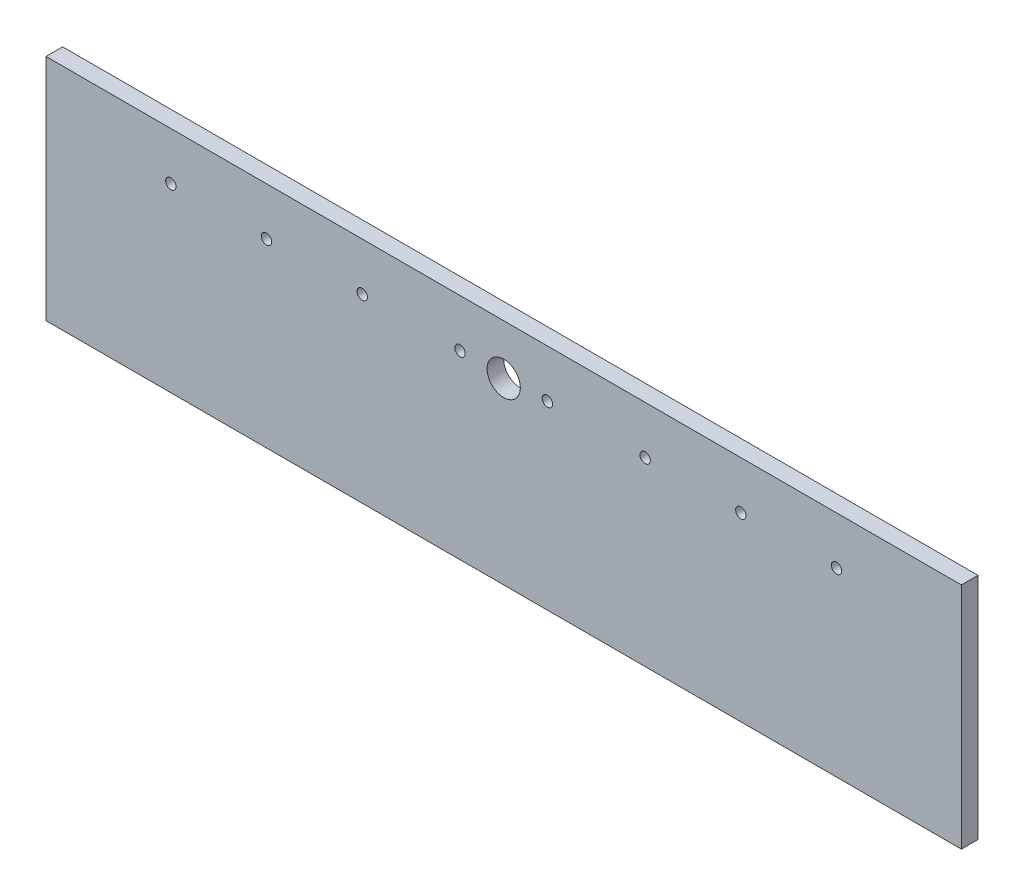
ISO-10303-21;
HEADER;
FILE_DESCRIPTION(('STEP AP214'),'2;1');
FILE_NAME('part.step','',(''),(''),'','','');
FILE_SCHEMA(('AUTOMOTIVE_DESIGN { 1 0 10303 214 1 1 1 1 }'));
ENDSEC;
DATA;
#1=APPLICATION_CONTEXT('core data for automotive mechanical design processes');
#2=APPLICATION_PROTOCOL_DEFINITION('international standard','automotive_design',2000,#1);
#3=PRODUCT_CONTEXT('',#1,'mechanical');
#4=PRODUCT('Part','Part','',(#3));
#5=PRODUCT_RELATED_PRODUCT_CATEGORY('part','',(#4));
#6=PRODUCT_DEFINITION_FORMATION('','',#4);
#7=PRODUCT_DEFINITION_CONTEXT('part definition',#1,'design');
#8=PRODUCT_DEFINITION('design','',#6,#7);
#9=PRODUCT_DEFINITION_SHAPE('','',#8);
#10=(LENGTH_UNIT() NAMED_UNIT(*) SI_UNIT(.MILLI.,.METRE.));
#11=(NAMED_UNIT(*) PLANE_ANGLE_UNIT() SI_UNIT($,.RADIAN.));
#12=(NAMED_UNIT(*) SI_UNIT($,.STERADIAN.) SOLID_ANGLE_UNIT());
#13=UNCERTAINTY_MEASURE_WITH_UNIT(LENGTH_MEASURE(1.E-05),#10,'distance_accuracy_value','');
#14=(GEOMETRIC_REPRESENTATION_CONTEXT(3) GLOBAL_UNCERTAINTY_ASSIGNED_CONTEXT((#13)) GLOBAL_UNIT_ASSIGNED_CONTEXT((#10,
#11,#12)) REPRESENTATION_CONTEXT('',''));
#15=CARTESIAN_POINT('',(0.,0.,0.));
#16=DIRECTION('',(0.,0.,1.));
#17=DIRECTION('',(1.,0.,0.));
#18=AXIS2_PLACEMENT_3D('',#15,#16,#17);
#19=CARTESIAN_POINT('',(0.,0.,25.4));
#20=DIRECTION('',(0.,0.,-1.));
#21=DIRECTION('',(-1.,0.,0.));
#22=AXIS2_PLACEMENT_3D('',#19,#20,#21);
#23=PLANE('',#22);
#24=DIRECTION('',(0.,-1.,0.));
#25=VECTOR('',#24,1.);
#26=CARTESIAN_POINT('',(0.,0.,25.4));
#27=LINE('',#26,#25);
#28=CARTESIAN_POINT('',(0.,349.25,25.4));
#29=VERTEX_POINT('',#28);
#30=CARTESIAN_POINT('',(0.,0.,25.4));
#31=VERTEX_POINT('',#30);
#32=EDGE_CURVE('E92',#29,#31,#27,.T.);
#33=ORIENTED_EDGE('',*,*,#32,.T.);
#34=DIRECTION('',(1.,0.,0.));
#35=VECTOR('',#34,1.);
#36=CARTESIAN_POINT('',(0.,0.,25.4));
#37=LINE('',#36,#35);
#38=CARTESIAN_POINT('',(1397.,0.,25.4));
#39=VERTEX_POINT('',#38);
#40=EDGE_CURVE('E87',#31,#39,#37,.T.);
#41=ORIENTED_EDGE('',*,*,#40,.T.);
#42=DIRECTION('',(0.,1.,0.));
#43=VECTOR('',#42,1.);
#44=CARTESIAN_POINT('',(1397.,0.,25.4));
#45=LINE('',#44,#43);
#46=CARTESIAN_POINT('',(1397.,349.25,25.4));
#47=VERTEX_POINT('',#46);
#48=EDGE_CURVE('E90',#39,#47,#45,.T.);
#49=ORIENTED_EDGE('',*,*,#48,.T.);
#50=DIRECTION('',(-1.,0.,0.));
#51=VECTOR('',#50,1.);
#52=CARTESIAN_POINT('',(0.,349.25,25.4));
#53=LINE('',#52,#51);
#54=EDGE_CURVE('E57',#47,#29,#53,.T.);
#55=ORIENTED_EDGE('',*,*,#54,.T.);
#56=EDGE_LOOP('',(#33,#41,#49,#55));
#57=FACE_BOUND('',#56,.T.);
#58=CARTESIAN_POINT('',(698.5,273.05,25.4));
#59=DIRECTION('',(0.,0.,1.));
#60=DIRECTION('',(1.,0.,0.));
#61=AXIS2_PLACEMENT_3D('',#58,#59,#60);
#62=CIRCLE('',#61,25.4);
#63=CARTESIAN_POINT('',(723.9,273.05,25.4));
#64=VERTEX_POINT('',#63);
#65=EDGE_CURVE('E112',#64,#64,#62,.T.);
#66=ORIENTED_EDGE('',*,*,#65,.F.);
#67=EDGE_LOOP('',(#66));
#68=FACE_BOUND('',#67,.T.);
#69=CARTESIAN_POINT('',(190.5,276.225,25.4));
#70=DIRECTION('',(0.,0.,1.));
#71=DIRECTION('',(1.,0.,0.));
#72=AXIS2_PLACEMENT_3D('',#69,#70,#71);
#73=CIRCLE('',#72,7.93749999999998);
#74=CARTESIAN_POINT('',(198.4375,276.225,25.4));
#75=VERTEX_POINT('',#74);
#76=EDGE_CURVE('E134',#75,#75,#73,.T.);
#77=ORIENTED_EDGE('',*,*,#76,.F.);
#78=EDGE_LOOP('',(#77));
#79=FACE_BOUND('',#78,.T.);
#80=CARTESIAN_POINT('',(336.55,276.225,25.4));
#81=DIRECTION('',(0.,0.,1.));
#82=DIRECTION('',(1.,0.,0.));
#83=AXIS2_PLACEMENT_3D('',#80,#81,#82);
#84=CIRCLE('',#83,7.93749999999998);
#85=CARTESIAN_POINT('',(344.4875,276.225,25.4));
#86=VERTEX_POINT('',#85);
#87=EDGE_CURVE('E142',#86,#86,#84,.T.);
#88=ORIENTED_EDGE('',*,*,#87,.F.);
#89=EDGE_LOOP('',(#88));
#90=FACE_BOUND('',#89,.T.);
#91=CARTESIAN_POINT('',(482.6,276.225,25.4));
#92=DIRECTION('',(0.,0.,1.));
#93=DIRECTION('',(1.,0.,0.));
#94=AXIS2_PLACEMENT_3D('',#91,#92,#93);
#95=CIRCLE('',#94,7.93749999999998);
#96=CARTESIAN_POINT('',(490.5375,276.225,25.4));
#97=VERTEX_POINT('',#96);
#98=EDGE_CURVE('E150',#97,#97,#95,.T.);
#99=ORIENTED_EDGE('',*,*,#98,.F.);
#100=EDGE_LOOP('',(#99));
#101=FACE_BOUND('',#100,.T.);
#102=CARTESIAN_POINT('',(631.825,276.225,25.4));
#103=DIRECTION('',(0.,0.,1.));
#104=DIRECTION('',(1.,0.,0.));
#105=AXIS2_PLACEMENT_3D('',#102,#103,#104);
#106=CIRCLE('',#105,7.93750000000009);
#107=CARTESIAN_POINT('',(639.7625,276.225,25.4));
#108=VERTEX_POINT('',#107);
#109=EDGE_CURVE('E158',#108,#108,#106,.T.);
#110=ORIENTED_EDGE('',*,*,#109,.F.);
#111=EDGE_LOOP('',(#110));
#112=FACE_BOUND('',#111,.T.);
#113=CARTESIAN_POINT('',(1206.5,276.225000000001,25.4));
#114=DIRECTION('',(0.,0.,1.));
#115=DIRECTION('',(-1.,0.,0.));
#116=AXIS2_PLACEMENT_3D('',#113,#114,#115);
#117=CIRCLE('',#116,7.93749999999978);
#118=CARTESIAN_POINT('',(1198.5625,276.225000000001,25.4));
#119=VERTEX_POINT('',#118);
#120=EDGE_CURVE('E166',#119,#119,#117,.T.);
#121=ORIENTED_EDGE('',*,*,#120,.F.);
#122=EDGE_LOOP('',(#121));
#123=FACE_BOUND('',#122,.T.);
#124=CARTESIAN_POINT('',(1060.45,276.225,25.4));
#125=DIRECTION('',(0.,0.,1.));
#126=DIRECTION('',(-1.,0.,0.));
#127=AXIS2_PLACEMENT_3D('',#124,#125,#126);
#128=CIRCLE('',#127,7.93749999999996);
#129=CARTESIAN_POINT('',(1052.5125,276.225,25.4));
#130=VERTEX_POINT('',#129);
#131=EDGE_CURVE('E174',#130,#130,#128,.T.);
#132=ORIENTED_EDGE('',*,*,#131,.F.);
#133=EDGE_LOOP('',(#132));
#134=FACE_BOUND('',#133,.T.);
#135=CARTESIAN_POINT('',(914.4,276.225,25.4));
#136=DIRECTION('',(0.,0.,1.));
#137=DIRECTION('',(-1.,0.,0.));
#138=AXIS2_PLACEMENT_3D('',#135,#136,#137);
#139=CIRCLE('',#138,7.93749999999998);
#140=CARTESIAN_POINT('',(906.4625,276.225,25.4));
#141=VERTEX_POINT('',#140);
#142=EDGE_CURVE('E182',#141,#141,#139,.T.);
#143=ORIENTED_EDGE('',*,*,#142,.F.);
#144=EDGE_LOOP('',(#143));
#145=FACE_BOUND('',#144,.T.);
#146=CARTESIAN_POINT('',(765.175,276.225,25.4));
#147=DIRECTION('',(0.,0.,1.));
#148=DIRECTION('',(-1.,0.,0.));
#149=AXIS2_PLACEMENT_3D('',#146,#147,#148);
#150=CIRCLE('',#149,7.9375000000001);
#151=CARTESIAN_POINT('',(757.2375,276.225,25.4));
#152=VERTEX_POINT('',#151);
#153=EDGE_CURVE('E190',#152,#152,#150,.T.);
#154=ORIENTED_EDGE('',*,*,#153,.F.);
#155=EDGE_LOOP('',(#154));
#156=FACE_BOUND('',#155,.T.);
#157=ADVANCED_FACE('F39',(#57,#68,#79,#90,#101,#112,#123,#134,#145,#156),#23,.F.);
#158=CARTESIAN_POINT('',(0.,0.,0.));
#159=DIRECTION('',(0.,0.,-1.));
#160=DIRECTION('',(-1.,0.,0.));
#161=AXIS2_PLACEMENT_3D('',#158,#159,#160);
#162=PLANE('',#161);
#163=CARTESIAN_POINT('',(914.4,276.225,0.));
#164=DIRECTION('',(0.,0.,1.));
#165=DIRECTION('',(-1.,0.,0.));
#166=AXIS2_PLACEMENT_3D('',#163,#164,#165);
#167=CIRCLE('',#166,7.93749999999998);
#168=CARTESIAN_POINT('',(906.4625,276.225,0.));
#169=VERTEX_POINT('',#168);
#170=EDGE_CURVE('E186',#169,#169,#167,.T.);
#171=ORIENTED_EDGE('',*,*,#170,.T.);
#172=EDGE_LOOP('',(#171));
#173=FACE_BOUND('',#172,.T.);
#174=CARTESIAN_POINT('',(1206.5,276.225000000001,0.));
#175=DIRECTION('',(0.,0.,1.));
#176=DIRECTION('',(-1.,0.,0.));
#177=AXIS2_PLACEMENT_3D('',#174,#175,#176);
#178=CIRCLE('',#177,7.93749999999978);
#179=CARTESIAN_POINT('',(1198.5625,276.225000000001,0.));
#180=VERTEX_POINT('',#179);
#181=EDGE_CURVE('E170',#180,#180,#178,.T.);
#182=ORIENTED_EDGE('',*,*,#181,.T.);
#183=EDGE_LOOP('',(#182));
#184=FACE_BOUND('',#183,.T.);
#185=CARTESIAN_POINT('',(482.6,276.225,0.));
#186=DIRECTION('',(0.,0.,1.));
#187=DIRECTION('',(1.,0.,0.));
#188=AXIS2_PLACEMENT_3D('',#185,#186,#187);
#189=CIRCLE('',#188,7.93749999999998);
#190=CARTESIAN_POINT('',(490.5375,276.225,0.));
#191=VERTEX_POINT('',#190);
#192=EDGE_CURVE('E154',#191,#191,#189,.T.);
#193=ORIENTED_EDGE('',*,*,#192,.T.);
#194=EDGE_LOOP('',(#193));
#195=FACE_BOUND('',#194,.T.);
#196=CARTESIAN_POINT('',(190.5,276.225,0.));
#197=DIRECTION('',(0.,0.,1.));
#198=DIRECTION('',(1.,0.,0.));
#199=AXIS2_PLACEMENT_3D('',#196,#197,#198);
#200=CIRCLE('',#199,7.93749999999998);
#201=CARTESIAN_POINT('',(198.4375,276.225,0.));
#202=VERTEX_POINT('',#201);
#203=EDGE_CURVE('E138',#202,#202,#200,.T.);
#204=ORIENTED_EDGE('',*,*,#203,.T.);
#205=EDGE_LOOP('',(#204));
#206=FACE_BOUND('',#205,.T.);
#207=DIRECTION('',(0.,-1.,0.));
#208=VECTOR('',#207,1.);
#209=CARTESIAN_POINT('',(0.,0.,0.));
#210=LINE('',#209,#208);
#211=CARTESIAN_POINT('',(0.,349.25,0.));
#212=VERTEX_POINT('',#211);
#213=CARTESIAN_POINT('',(0.,0.,0.));
#214=VERTEX_POINT('',#213);
#215=EDGE_CURVE('E108',#212,#214,#210,.T.);
#216=ORIENTED_EDGE('',*,*,#215,.F.);
#217=DIRECTION('',(-1.,0.,0.));
#218=VECTOR('',#217,1.);
#219=CARTESIAN_POINT('',(0.,349.25,0.));
#220=LINE('',#219,#218);
#221=CARTESIAN_POINT('',(1397.,349.25,0.));
#222=VERTEX_POINT('',#221);
#223=EDGE_CURVE('E80',#222,#212,#220,.T.);
#224=ORIENTED_EDGE('',*,*,#223,.F.);
#225=DIRECTION('',(0.,1.,0.));
#226=VECTOR('',#225,1.);
#227=CARTESIAN_POINT('',(1397.,0.,0.));
#228=LINE('',#227,#226);
#229=CARTESIAN_POINT('',(1397.,0.,0.));
#230=VERTEX_POINT('',#229);
#231=EDGE_CURVE('E74',#230,#222,#228,.T.);
#232=ORIENTED_EDGE('',*,*,#231,.F.);
#233=DIRECTION('',(1.,0.,0.));
#234=VECTOR('',#233,1.);
#235=CARTESIAN_POINT('',(0.,0.,0.));
#236=LINE('',#235,#234);
#237=EDGE_CURVE('E97',#214,#230,#236,.T.);
#238=ORIENTED_EDGE('',*,*,#237,.F.);
#239=EDGE_LOOP('',(#216,#224,#232,#238));
#240=FACE_BOUND('',#239,.T.);
#241=CARTESIAN_POINT('',(698.5,273.05,0.));
#242=DIRECTION('',(0.,0.,1.));
#243=DIRECTION('',(1.,0.,0.));
#244=AXIS2_PLACEMENT_3D('',#241,#242,#243);
#245=CIRCLE('',#244,25.4);
#246=CARTESIAN_POINT('',(723.9,273.05,0.));
#247=VERTEX_POINT('',#246);
#248=EDGE_CURVE('E130',#247,#247,#245,.T.);
#249=ORIENTED_EDGE('',*,*,#248,.T.);
#250=EDGE_LOOP('',(#249));
#251=FACE_BOUND('',#250,.T.);
#252=CARTESIAN_POINT('',(336.55,276.225,0.));
#253=DIRECTION('',(0.,0.,1.));
#254=DIRECTION('',(1.,0.,0.));
#255=AXIS2_PLACEMENT_3D('',#252,#253,#254);
#256=CIRCLE('',#255,7.93749999999998);
#257=CARTESIAN_POINT('',(344.4875,276.225,0.));
#258=VERTEX_POINT('',#257);
#259=EDGE_CURVE('E146',#258,#258,#256,.T.);
#260=ORIENTED_EDGE('',*,*,#259,.T.);
#261=EDGE_LOOP('',(#260));
#262=FACE_BOUND('',#261,.T.);
#263=CARTESIAN_POINT('',(631.825,276.225,0.));
#264=DIRECTION('',(0.,0.,1.));
#265=DIRECTION('',(1.,0.,0.));
#266=AXIS2_PLACEMENT_3D('',#263,#264,#265);
#267=CIRCLE('',#266,7.93750000000009);
#268=CARTESIAN_POINT('',(639.7625,276.225,0.));
#269=VERTEX_POINT('',#268);
#270=EDGE_CURVE('E162',#269,#269,#267,.T.);
#271=ORIENTED_EDGE('',*,*,#270,.T.);
#272=EDGE_LOOP('',(#271));
#273=FACE_BOUND('',#272,.T.);
#274=CARTESIAN_POINT('',(1060.45,276.225,0.));
#275=DIRECTION('',(0.,0.,1.));
#276=DIRECTION('',(-1.,0.,0.));
#277=AXIS2_PLACEMENT_3D('',#274,#275,#276);
#278=CIRCLE('',#277,7.93749999999996);
#279=CARTESIAN_POINT('',(1052.5125,276.225,0.));
#280=VERTEX_POINT('',#279);
#281=EDGE_CURVE('E178',#280,#280,#278,.T.);
#282=ORIENTED_EDGE('',*,*,#281,.T.);
#283=EDGE_LOOP('',(#282));
#284=FACE_BOUND('',#283,.T.);
#285=CARTESIAN_POINT('',(765.175,276.225,0.));
#286=DIRECTION('',(0.,0.,1.));
#287=DIRECTION('',(-1.,0.,0.));
#288=AXIS2_PLACEMENT_3D('',#285,#286,#287);
#289=CIRCLE('',#288,7.9375000000001);
#290=CARTESIAN_POINT('',(757.2375,276.225,0.));
#291=VERTEX_POINT('',#290);
#292=EDGE_CURVE('E194',#291,#291,#289,.T.);
#293=ORIENTED_EDGE('',*,*,#292,.T.);
#294=EDGE_LOOP('',(#293));
#295=FACE_BOUND('',#294,.T.);
#296=ADVANCED_FACE('F125',(#173,#184,#195,#206,#240,#251,#262,#273,#284,#295),#162,.T.);
#297=CARTESIAN_POINT('',(0.,0.,25.4));
#298=DIRECTION('',(1.,0.,0.));
#299=DIRECTION('',(0.,0.,-1.));
#300=AXIS2_PLACEMENT_3D('',#297,#298,#299);
#301=PLANE('',#300);
#302=ORIENTED_EDGE('',*,*,#215,.T.);
#303=DIRECTION('',(0.,0.,-1.));
#304=VECTOR('',#303,1.);
#305=CARTESIAN_POINT('',(0.,0.,25.4));
#306=LINE('',#305,#304);
#307=EDGE_CURVE('E11',#31,#214,#306,.T.);
#308=ORIENTED_EDGE('',*,*,#307,.F.);
#309=ORIENTED_EDGE('',*,*,#32,.F.);
#310=DIRECTION('',(0.,0.,-1.));
#311=VECTOR('',#310,1.);
#312=CARTESIAN_POINT('',(0.,349.25,25.4));
#313=LINE('',#312,#311);
#314=EDGE_CURVE('E104',#29,#212,#313,.T.);
#315=ORIENTED_EDGE('',*,*,#314,.T.);
#316=EDGE_LOOP('',(#302,#308,#309,#315));
#317=FACE_BOUND('',#316,.T.);
#318=ADVANCED_FACE('F41',(#317),#301,.F.);
#319=CARTESIAN_POINT('',(0.,0.,25.4));
#320=DIRECTION('',(0.,1.,0.));
#321=DIRECTION('',(0.,0.,1.));
#322=AXIS2_PLACEMENT_3D('',#319,#320,#321);
#323=PLANE('',#322);
#324=ORIENTED_EDGE('',*,*,#237,.T.);
#325=DIRECTION('',(0.,0.,-1.));
#326=VECTOR('',#325,1.);
#327=CARTESIAN_POINT('',(1397.,0.,25.4));
#328=LINE('',#327,#326);
#329=EDGE_CURVE('E49',#39,#230,#328,.T.);
#330=ORIENTED_EDGE('',*,*,#329,.F.);
#331=ORIENTED_EDGE('',*,*,#40,.F.);
#332=ORIENTED_EDGE('',*,*,#307,.T.);
#333=EDGE_LOOP('',(#324,#330,#331,#332));
#334=FACE_BOUND('',#333,.T.);
#335=ADVANCED_FACE('F96',(#334),#323,.F.);
#336=CARTESIAN_POINT('',(1397.,0.,25.4));
#337=DIRECTION('',(-1.,0.,0.));
#338=DIRECTION('',(0.,-1.,0.));
#339=AXIS2_PLACEMENT_3D('',#336,#337,#338);
#340=PLANE('',#339);
#341=ORIENTED_EDGE('',*,*,#231,.T.);
#342=DIRECTION('',(0.,0.,-1.));
#343=VECTOR('',#342,1.);
#344=CARTESIAN_POINT('',(1397.,349.25,25.4));
#345=LINE('',#344,#343);
#346=EDGE_CURVE('E99',#47,#222,#345,.T.);
#347=ORIENTED_EDGE('',*,*,#346,.F.);
#348=ORIENTED_EDGE('',*,*,#48,.F.);
#349=ORIENTED_EDGE('',*,*,#329,.T.);
#350=EDGE_LOOP('',(#341,#347,#348,#349));
#351=FACE_BOUND('',#350,.T.);
#352=ADVANCED_FACE('F100',(#351),#340,.F.);
#353=CARTESIAN_POINT('',(0.,349.25,25.4));
#354=DIRECTION('',(0.,-1.,0.));
#355=DIRECTION('',(0.,0.,-1.));
#356=AXIS2_PLACEMENT_3D('',#353,#354,#355);
#357=PLANE('',#356);
#358=ORIENTED_EDGE('',*,*,#223,.T.);
#359=ORIENTED_EDGE('',*,*,#314,.F.);
#360=ORIENTED_EDGE('',*,*,#54,.F.);
#361=ORIENTED_EDGE('',*,*,#346,.T.);
#362=EDGE_LOOP('',(#358,#359,#360,#361));
#363=FACE_BOUND('',#362,.T.);
#364=ADVANCED_FACE('F122',(#363),#357,.F.);
#365=CARTESIAN_POINT('',(698.5,273.05,25.4));
#366=DIRECTION('',(0.,0.,-1.));
#367=DIRECTION('',(-1.,0.,0.));
#368=AXIS2_PLACEMENT_3D('',#365,#366,#367);
#369=CYLINDRICAL_SURFACE('',#368,25.4);
#370=ORIENTED_EDGE('',*,*,#65,.T.);
#371=EDGE_LOOP('',(#370));
#372=FACE_BOUND('',#371,.T.);
#373=ORIENTED_EDGE('',*,*,#248,.F.);
#374=EDGE_LOOP('',(#373));
#375=FACE_BOUND('',#374,.T.);
#376=ADVANCED_FACE('F213',(#372,#375),#369,.F.);
#377=CARTESIAN_POINT('',(190.5,276.225,25.4));
#378=DIRECTION('',(0.,0.,-1.));
#379=DIRECTION('',(-1.,0.,0.));
#380=AXIS2_PLACEMENT_3D('',#377,#378,#379);
#381=CYLINDRICAL_SURFACE('',#380,7.93749999999998);
#382=ORIENTED_EDGE('',*,*,#76,.T.);
#383=EDGE_LOOP('',(#382));
#384=FACE_BOUND('',#383,.T.);
#385=ORIENTED_EDGE('',*,*,#203,.F.);
#386=EDGE_LOOP('',(#385));
#387=FACE_BOUND('',#386,.T.);
#388=ADVANCED_FACE('F259',(#384,#387),#381,.F.);
#389=CARTESIAN_POINT('',(336.55,276.225,25.4));
#390=DIRECTION('',(0.,0.,-1.));
#391=DIRECTION('',(-1.,0.,0.));
#392=AXIS2_PLACEMENT_3D('',#389,#390,#391);
#393=CYLINDRICAL_SURFACE('',#392,7.93749999999998);
#394=ORIENTED_EDGE('',*,*,#87,.T.);
#395=EDGE_LOOP('',(#394));
#396=FACE_BOUND('',#395,.T.);
#397=ORIENTED_EDGE('',*,*,#259,.F.);
#398=EDGE_LOOP('',(#397));
#399=FACE_BOUND('',#398,.T.);
#400=ADVANCED_FACE('F267',(#396,#399),#393,.F.);
#401=CARTESIAN_POINT('',(482.6,276.225,25.4));
#402=DIRECTION('',(0.,0.,-1.));
#403=DIRECTION('',(-1.,0.,0.));
#404=AXIS2_PLACEMENT_3D('',#401,#402,#403);
#405=CYLINDRICAL_SURFACE('',#404,7.93749999999998);
#406=ORIENTED_EDGE('',*,*,#98,.T.);
#407=EDGE_LOOP('',(#406));
#408=FACE_BOUND('',#407,.T.);
#409=ORIENTED_EDGE('',*,*,#192,.F.);
#410=EDGE_LOOP('',(#409));
#411=FACE_BOUND('',#410,.T.);
#412=ADVANCED_FACE('F275',(#408,#411),#405,.F.);
#413=CARTESIAN_POINT('',(631.825,276.225,25.4));
#414=DIRECTION('',(0.,0.,-1.));
#415=DIRECTION('',(-1.,0.,0.));
#416=AXIS2_PLACEMENT_3D('',#413,#414,#415);
#417=CYLINDRICAL_SURFACE('',#416,7.93750000000009);
#418=ORIENTED_EDGE('',*,*,#109,.T.);
#419=EDGE_LOOP('',(#418));
#420=FACE_BOUND('',#419,.T.);
#421=ORIENTED_EDGE('',*,*,#270,.F.);
#422=EDGE_LOOP('',(#421));
#423=FACE_BOUND('',#422,.T.);
#424=ADVANCED_FACE('F284',(#420,#423),#417,.F.);
#425=CARTESIAN_POINT('',(1206.5,276.225000000001,25.4));
#426=DIRECTION('',(0.,0.,-1.));
#427=DIRECTION('',(-1.,0.,0.));
#428=AXIS2_PLACEMENT_3D('',#425,#426,#427);
#429=CYLINDRICAL_SURFACE('',#428,7.93749999999978);
#430=ORIENTED_EDGE('',*,*,#120,.T.);
#431=EDGE_LOOP('',(#430));
#432=FACE_BOUND('',#431,.T.);
#433=ORIENTED_EDGE('',*,*,#181,.F.);
#434=EDGE_LOOP('',(#433));
#435=FACE_BOUND('',#434,.T.);
#436=ADVANCED_FACE('F293',(#432,#435),#429,.F.);
#437=CARTESIAN_POINT('',(1060.45,276.225,25.4));
#438=DIRECTION('',(0.,0.,-1.));
#439=DIRECTION('',(-1.,0.,0.));
#440=AXIS2_PLACEMENT_3D('',#437,#438,#439);
#441=CYLINDRICAL_SURFACE('',#440,7.93749999999996);
#442=ORIENTED_EDGE('',*,*,#131,.T.);
#443=EDGE_LOOP('',(#442));
#444=FACE_BOUND('',#443,.T.);
#445=ORIENTED_EDGE('',*,*,#281,.F.);
#446=EDGE_LOOP('',(#445));
#447=FACE_BOUND('',#446,.T.);
#448=ADVANCED_FACE('F302',(#444,#447),#441,.F.);
#449=CARTESIAN_POINT('',(914.4,276.225,25.4));
#450=DIRECTION('',(0.,0.,-1.));
#451=DIRECTION('',(-1.,0.,0.));
#452=AXIS2_PLACEMENT_3D('',#449,#450,#451);
#453=CYLINDRICAL_SURFACE('',#452,7.93749999999998);
#454=ORIENTED_EDGE('',*,*,#142,.T.);
#455=EDGE_LOOP('',(#454));
#456=FACE_BOUND('',#455,.T.);
#457=ORIENTED_EDGE('',*,*,#170,.F.);
#458=EDGE_LOOP('',(#457));
#459=FACE_BOUND('',#458,.T.);
#460=ADVANCED_FACE('F311',(#456,#459),#453,.F.);
#461=CARTESIAN_POINT('',(765.175,276.225,25.4));
#462=DIRECTION('',(0.,0.,-1.));
#463=DIRECTION('',(-1.,0.,0.));
#464=AXIS2_PLACEMENT_3D('',#461,#462,#463);
#465=CYLINDRICAL_SURFACE('',#464,7.9375000000001);
#466=ORIENTED_EDGE('',*,*,#153,.T.);
#467=EDGE_LOOP('',(#466));
#468=FACE_BOUND('',#467,.T.);
#469=ORIENTED_EDGE('',*,*,#292,.F.);
#470=EDGE_LOOP('',(#469));
#471=FACE_BOUND('',#470,.T.);
#472=ADVANCED_FACE('F202',(#468,#471),#465,.F.);
#473=CLOSED_SHELL('',(#157,#296,#318,#335,#352,#364,#376,#388,#400,#412,#424,#436,#448,#460,#472));
#474=MANIFOLD_SOLID_BREP('B2',#473);
#475=ADVANCED_BREP_SHAPE_REPRESENTATION('',(#18,#474),#14);
#476=SHAPE_DEFINITION_REPRESENTATION(#9,#475);
ENDSEC;
END-ISO-10303-21;
